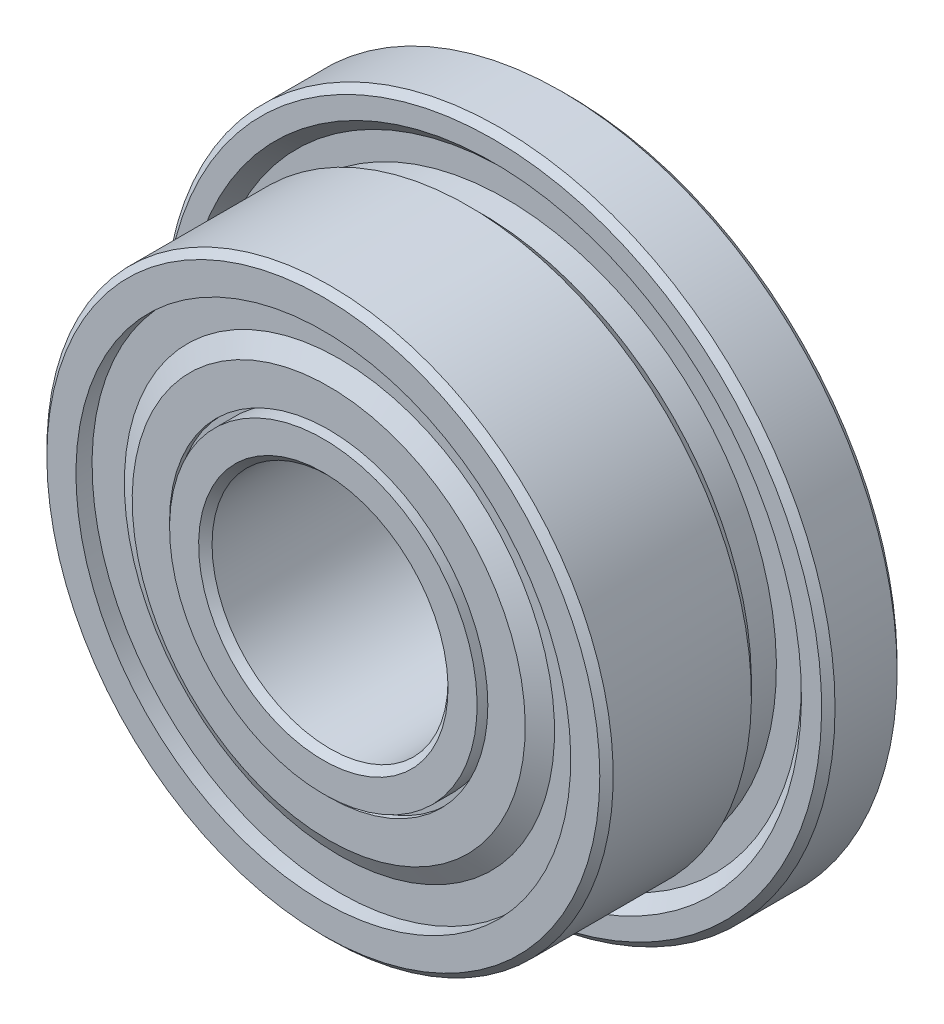
ISO-10303-21;
HEADER;
FILE_DESCRIPTION(('STEP AP214'),'2;1');
FILE_NAME('part.step','',(''),(''),'','','');
FILE_SCHEMA(('AUTOMOTIVE_DESIGN { 1 0 10303 214 1 1 1 1 }'));
ENDSEC;
DATA;
#1=APPLICATION_CONTEXT('core data for automotive mechanical design processes');
#2=APPLICATION_PROTOCOL_DEFINITION('international standard','automotive_design',2000,#1);
#3=PRODUCT_CONTEXT('',#1,'mechanical');
#4=PRODUCT('Part','Part','',(#3));
#5=PRODUCT_RELATED_PRODUCT_CATEGORY('part','',(#4));
#6=PRODUCT_DEFINITION_FORMATION('','',#4);
#7=PRODUCT_DEFINITION_CONTEXT('part definition',#1,'design');
#8=PRODUCT_DEFINITION('design','',#6,#7);
#9=PRODUCT_DEFINITION_SHAPE('','',#8);
#10=(LENGTH_UNIT() NAMED_UNIT(*) SI_UNIT(.MILLI.,.METRE.));
#11=(NAMED_UNIT(*) PLANE_ANGLE_UNIT() SI_UNIT($,.RADIAN.));
#12=(NAMED_UNIT(*) SI_UNIT($,.STERADIAN.) SOLID_ANGLE_UNIT());
#13=UNCERTAINTY_MEASURE_WITH_UNIT(LENGTH_MEASURE(1.E-05),#10,'distance_accuracy_value','');
#14=(GEOMETRIC_REPRESENTATION_CONTEXT(3) GLOBAL_UNCERTAINTY_ASSIGNED_CONTEXT((#13)) GLOBAL_UNIT_ASSIGNED_CONTEXT((#10,
#11,#12)) REPRESENTATION_CONTEXT('',''));
#15=CARTESIAN_POINT('',(0.,0.,0.));
#16=DIRECTION('',(0.,0.,1.));
#17=DIRECTION('',(1.,0.,0.));
#18=AXIS2_PLACEMENT_3D('',#15,#16,#17);
#19=CARTESIAN_POINT('',(0.,0.,0.));
#20=DIRECTION('',(0.,0.,1.));
#21=DIRECTION('',(0.,-1.,0.));
#22=AXIS2_PLACEMENT_3D('',#19,#20,#21);
#23=CYLINDRICAL_SURFACE('',#22,2.62083333333333);
#24=CARTESIAN_POINT('',(0.,0.,-1.0725));
#25=DIRECTION('',(0.,0.,1.));
#26=DIRECTION('',(0.,-1.,0.));
#27=AXIS2_PLACEMENT_3D('',#24,#25,#26);
#28=CIRCLE('',#27,2.62083333333333);
#29=CARTESIAN_POINT('',(0.,-2.62083333333333,-1.0725));
#30=VERTEX_POINT('',#29);
#31=EDGE_CURVE('E85',#30,#30,#28,.T.);
#32=ORIENTED_EDGE('',*,*,#31,.F.);
#33=EDGE_LOOP('',(#32));
#34=FACE_BOUND('',#33,.T.);
#35=CARTESIAN_POINT('',(0.,0.,-1.129375));
#36=DIRECTION('',(0.,0.,1.));
#37=DIRECTION('',(0.,-1.,0.));
#38=AXIS2_PLACEMENT_3D('',#35,#36,#37);
#39=CIRCLE('',#38,2.62083333333333);
#40=CARTESIAN_POINT('',(0.,-2.62083333333333,-1.129375));
#41=VERTEX_POINT('',#40);
#42=EDGE_CURVE('E12',#41,#41,#39,.T.);
#43=ORIENTED_EDGE('',*,*,#42,.T.);
#44=EDGE_LOOP('',(#43));
#45=FACE_BOUND('',#44,.T.);
#46=ADVANCED_FACE('F49',(#34,#45),#23,.T.);
#47=CARTESIAN_POINT('',(0.,2.62083333333333,-1.129375));
#48=DIRECTION('',(0.,0.,1.));
#49=DIRECTION('',(0.,-1.,0.));
#50=AXIS2_PLACEMENT_3D('',#47,#48,#49);
#51=PLANE('',#50);
#52=ORIENTED_EDGE('',*,*,#42,.F.);
#53=EDGE_LOOP('',(#52));
#54=FACE_BOUND('',#53,.T.);
#55=CARTESIAN_POINT('',(0.,0.,-1.129375));
#56=DIRECTION('',(0.,0.,1.));
#57=DIRECTION('',(0.,-1.,0.));
#58=AXIS2_PLACEMENT_3D('',#55,#56,#57);
#59=CIRCLE('',#58,2.27893008651);
#60=CARTESIAN_POINT('',(0.,-2.27893008651,-1.129375));
#61=VERTEX_POINT('',#60);
#62=EDGE_CURVE('E56',#61,#61,#59,.T.);
#63=ORIENTED_EDGE('',*,*,#62,.T.);
#64=EDGE_LOOP('',(#63));
#65=FACE_BOUND('',#64,.T.);
#66=ADVANCED_FACE('F92',(#54,#65),#51,.F.);
#67=CARTESIAN_POINT('',(0.,0.,-1.243125));
#68=DIRECTION('',(0.,0.,1.));
#69=DIRECTION('',(0.,-1.,0.));
#70=AXIS2_PLACEMENT_3D('',#67,#68,#69);
#71=CONICAL_SURFACE('',#70,2.08190930714904,1.0471975511966);
#72=ORIENTED_EDGE('',*,*,#62,.F.);
#73=EDGE_LOOP('',(#72));
#74=FACE_BOUND('',#73,.T.);
#75=CARTESIAN_POINT('',(0.,0.,-1.243125));
#76=DIRECTION('',(0.,0.,1.));
#77=DIRECTION('',(0.,-1.,0.));
#78=AXIS2_PLACEMENT_3D('',#75,#76,#77);
#79=CIRCLE('',#78,2.08190930714904);
#80=CARTESIAN_POINT('',(0.,-2.08190930714904,-1.243125));
#81=VERTEX_POINT('',#80);
#82=EDGE_CURVE('E63',#81,#81,#79,.T.);
#83=ORIENTED_EDGE('',*,*,#82,.T.);
#84=EDGE_LOOP('',(#83));
#85=FACE_BOUND('',#84,.T.);
#86=ADVANCED_FACE('F96',(#74,#85),#71,.T.);
#87=CARTESIAN_POINT('',(0.,2.08190930714904,-1.243125));
#88=DIRECTION('',(0.,0.,1.));
#89=DIRECTION('',(0.,-1.,0.));
#90=AXIS2_PLACEMENT_3D('',#87,#88,#89);
#91=PLANE('',#90);
#92=ORIENTED_EDGE('',*,*,#82,.F.);
#93=EDGE_LOOP('',(#92));
#94=FACE_BOUND('',#93,.T.);
#95=CARTESIAN_POINT('',(0.,0.,-1.243125));
#96=DIRECTION('',(0.,0.,1.));
#97=DIRECTION('',(0.,-1.,0.));
#98=AXIS2_PLACEMENT_3D('',#95,#96,#97);
#99=CIRCLE('',#98,1.68604166666667);
#100=CARTESIAN_POINT('',(0.,-1.68604166666667,-1.243125));
#101=VERTEX_POINT('',#100);
#102=EDGE_CURVE('E69',#101,#101,#99,.T.);
#103=ORIENTED_EDGE('',*,*,#102,.T.);
#104=EDGE_LOOP('',(#103));
#105=FACE_BOUND('',#104,.T.);
#106=ADVANCED_FACE('F101',(#94,#105),#91,.F.);
#107=CARTESIAN_POINT('',(0.,0.,0.));
#108=DIRECTION('',(0.,0.,1.));
#109=DIRECTION('',(0.,-1.,0.));
#110=AXIS2_PLACEMENT_3D('',#107,#108,#109);
#111=CYLINDRICAL_SURFACE('',#110,1.68604166666667);
#112=ORIENTED_EDGE('',*,*,#102,.F.);
#113=EDGE_LOOP('',(#112));
#114=FACE_BOUND('',#113,.T.);
#115=CARTESIAN_POINT('',(0.,0.,-1.18625));
#116=DIRECTION('',(0.,0.,1.));
#117=DIRECTION('',(0.,-1.,0.));
#118=AXIS2_PLACEMENT_3D('',#115,#116,#117);
#119=CIRCLE('',#118,1.68604166666667);
#120=CARTESIAN_POINT('',(0.,-1.68604166666667,-1.18625));
#121=VERTEX_POINT('',#120);
#122=EDGE_CURVE('E75',#121,#121,#119,.T.);
#123=ORIENTED_EDGE('',*,*,#122,.T.);
#124=EDGE_LOOP('',(#123));
#125=FACE_BOUND('',#124,.T.);
#126=ADVANCED_FACE('F107',(#114,#125),#111,.F.);
#127=CARTESIAN_POINT('',(0.,2.06666969682952,-1.18625));
#128=DIRECTION('',(0.,0.,-1.));
#129=DIRECTION('',(0.,1.,0.));
#130=AXIS2_PLACEMENT_3D('',#127,#128,#129);
#131=PLANE('',#130);
#132=ORIENTED_EDGE('',*,*,#122,.F.);
#133=EDGE_LOOP('',(#132));
#134=FACE_BOUND('',#133,.T.);
#135=CARTESIAN_POINT('',(0.,0.,-1.18625));
#136=DIRECTION('',(0.,0.,1.));
#137=DIRECTION('',(0.,-1.,0.));
#138=AXIS2_PLACEMENT_3D('',#135,#136,#137);
#139=CIRCLE('',#138,2.06666969682952);
#140=CARTESIAN_POINT('',(0.,-2.06666969682952,-1.18625));
#141=VERTEX_POINT('',#140);
#142=EDGE_CURVE('E78',#141,#141,#139,.T.);
#143=ORIENTED_EDGE('',*,*,#142,.T.);
#144=EDGE_LOOP('',(#143));
#145=FACE_BOUND('',#144,.T.);
#146=ADVANCED_FACE('F111',(#134,#145),#131,.F.);
#147=CARTESIAN_POINT('',(0.,0.,-1.0725));
#148=DIRECTION('',(0.,0.,1.));
#149=DIRECTION('',(0.,-1.,0.));
#150=AXIS2_PLACEMENT_3D('',#147,#148,#149);
#151=CONICAL_SURFACE('',#150,2.26369047619048,1.0471975511966);
#152=ORIENTED_EDGE('',*,*,#142,.F.);
#153=EDGE_LOOP('',(#152));
#154=FACE_BOUND('',#153,.T.);
#155=CARTESIAN_POINT('',(0.,0.,-1.0725));
#156=DIRECTION('',(0.,0.,1.));
#157=DIRECTION('',(0.,-1.,0.));
#158=AXIS2_PLACEMENT_3D('',#155,#156,#157);
#159=CIRCLE('',#158,2.26369047619048);
#160=CARTESIAN_POINT('',(0.,-2.26369047619048,-1.0725));
#161=VERTEX_POINT('',#160);
#162=EDGE_CURVE('E82',#161,#161,#159,.T.);
#163=ORIENTED_EDGE('',*,*,#162,.T.);
#164=EDGE_LOOP('',(#163));
#165=FACE_BOUND('',#164,.T.);
#166=ADVANCED_FACE('F115',(#154,#165),#151,.F.);
#167=CARTESIAN_POINT('',(0.,2.62083333333333,-1.0725));
#168=DIRECTION('',(0.,0.,-1.));
#169=DIRECTION('',(0.,1.,0.));
#170=AXIS2_PLACEMENT_3D('',#167,#168,#169);
#171=PLANE('',#170);
#172=ORIENTED_EDGE('',*,*,#162,.F.);
#173=EDGE_LOOP('',(#172));
#174=FACE_BOUND('',#173,.T.);
#175=ORIENTED_EDGE('',*,*,#31,.T.);
#176=EDGE_LOOP('',(#175));
#177=FACE_BOUND('',#176,.T.);
#178=ADVANCED_FACE('F89',(#174,#177),#171,.F.);
#179=CLOSED_SHELL('',(#46,#66,#86,#106,#126,#146,#166,#178));
#180=MANIFOLD_SOLID_BREP('B2',#179);
#181=CARTESIAN_POINT('',(0.,0.,0.));
#182=DIRECTION('',(0.,0.,1.));
#183=DIRECTION('',(0.,-1.,0.));
#184=AXIS2_PLACEMENT_3D('',#181,#182,#183);
#185=CYLINDRICAL_SURFACE('',#184,2.62083333333333);
#186=CARTESIAN_POINT('',(0.,0.,1.129375));
#187=DIRECTION('',(0.,0.,1.));
#188=DIRECTION('',(0.,-1.,0.));
#189=AXIS2_PLACEMENT_3D('',#186,#187,#188);
#190=CIRCLE('',#189,2.62083333333333);
#191=CARTESIAN_POINT('',(0.,-2.62083333333333,1.129375));
#192=VERTEX_POINT('',#191);
#193=EDGE_CURVE('E48',#192,#192,#190,.T.);
#194=ORIENTED_EDGE('',*,*,#193,.F.);
#195=EDGE_LOOP('',(#194));
#196=FACE_BOUND('',#195,.T.);
#197=CARTESIAN_POINT('',(0.,0.,1.0725));
#198=DIRECTION('',(0.,0.,1.));
#199=DIRECTION('',(0.,-1.,0.));
#200=AXIS2_PLACEMENT_3D('',#197,#198,#199);
#201=CIRCLE('',#200,2.62083333333333);
#202=CARTESIAN_POINT('',(0.,-2.62083333333333,1.0725));
#203=VERTEX_POINT('',#202);
#204=EDGE_CURVE('E226',#203,#203,#201,.T.);
#205=ORIENTED_EDGE('',*,*,#204,.T.);
#206=EDGE_LOOP('',(#205));
#207=FACE_BOUND('',#206,.T.);
#208=ADVANCED_FACE('F190',(#196,#207),#185,.T.);
#209=CARTESIAN_POINT('',(0.,2.62083333333333,1.129375));
#210=DIRECTION('',(0.,0.,-1.));
#211=DIRECTION('',(0.,1.,0.));
#212=AXIS2_PLACEMENT_3D('',#209,#210,#211);
#213=PLANE('',#212);
#214=CARTESIAN_POINT('',(0.,0.,1.129375));
#215=DIRECTION('',(0.,0.,1.));
#216=DIRECTION('',(0.,-1.,0.));
#217=AXIS2_PLACEMENT_3D('',#214,#215,#216);
#218=CIRCLE('',#217,2.27893008651);
#219=CARTESIAN_POINT('',(0.,-2.27893008651,1.129375));
#220=VERTEX_POINT('',#219);
#221=EDGE_CURVE('E197',#220,#220,#218,.T.);
#222=ORIENTED_EDGE('',*,*,#221,.F.);
#223=EDGE_LOOP('',(#222));
#224=FACE_BOUND('',#223,.T.);
#225=ORIENTED_EDGE('',*,*,#193,.T.);
#226=EDGE_LOOP('',(#225));
#227=FACE_BOUND('',#226,.T.);
#228=ADVANCED_FACE('F263',(#224,#227),#213,.F.);
#229=CARTESIAN_POINT('',(0.,0.,1.129375));
#230=DIRECTION('',(0.,0.,-1.));
#231=DIRECTION('',(0.,1.,0.));
#232=AXIS2_PLACEMENT_3D('',#229,#230,#231);
#233=CONICAL_SURFACE('',#232,2.27893008651,1.0471975511966);
#234=CARTESIAN_POINT('',(0.,0.,1.243125));
#235=DIRECTION('',(0.,0.,1.));
#236=DIRECTION('',(0.,-1.,0.));
#237=AXIS2_PLACEMENT_3D('',#234,#235,#236);
#238=CIRCLE('',#237,2.08190930714904);
#239=CARTESIAN_POINT('',(0.,-2.08190930714904,1.243125));
#240=VERTEX_POINT('',#239);
#241=EDGE_CURVE('E204',#240,#240,#238,.T.);
#242=ORIENTED_EDGE('',*,*,#241,.F.);
#243=EDGE_LOOP('',(#242));
#244=FACE_BOUND('',#243,.T.);
#245=ORIENTED_EDGE('',*,*,#221,.T.);
#246=EDGE_LOOP('',(#245));
#247=FACE_BOUND('',#246,.T.);
#248=ADVANCED_FACE('F258',(#244,#247),#233,.T.);
#249=CARTESIAN_POINT('',(0.,2.08190930714904,1.243125));
#250=DIRECTION('',(0.,0.,-1.));
#251=DIRECTION('',(0.,1.,0.));
#252=AXIS2_PLACEMENT_3D('',#249,#250,#251);
#253=PLANE('',#252);
#254=CARTESIAN_POINT('',(0.,0.,1.243125));
#255=DIRECTION('',(0.,0.,1.));
#256=DIRECTION('',(0.,-1.,0.));
#257=AXIS2_PLACEMENT_3D('',#254,#255,#256);
#258=CIRCLE('',#257,1.68604166666667);
#259=CARTESIAN_POINT('',(0.,-1.68604166666667,1.243125));
#260=VERTEX_POINT('',#259);
#261=EDGE_CURVE('E210',#260,#260,#258,.T.);
#262=ORIENTED_EDGE('',*,*,#261,.F.);
#263=EDGE_LOOP('',(#262));
#264=FACE_BOUND('',#263,.T.);
#265=ORIENTED_EDGE('',*,*,#241,.T.);
#266=EDGE_LOOP('',(#265));
#267=FACE_BOUND('',#266,.T.);
#268=ADVANCED_FACE('F252',(#264,#267),#253,.F.);
#269=CARTESIAN_POINT('',(0.,0.,0.));
#270=DIRECTION('',(0.,0.,1.));
#271=DIRECTION('',(0.,-1.,0.));
#272=AXIS2_PLACEMENT_3D('',#269,#270,#271);
#273=CYLINDRICAL_SURFACE('',#272,1.68604166666667);
#274=CARTESIAN_POINT('',(0.,0.,1.18625));
#275=DIRECTION('',(0.,0.,1.));
#276=DIRECTION('',(0.,-1.,0.));
#277=AXIS2_PLACEMENT_3D('',#274,#275,#276);
#278=CIRCLE('',#277,1.68604166666667);
#279=CARTESIAN_POINT('',(0.,-1.68604166666667,1.18625));
#280=VERTEX_POINT('',#279);
#281=EDGE_CURVE('E216',#280,#280,#278,.T.);
#282=ORIENTED_EDGE('',*,*,#281,.F.);
#283=EDGE_LOOP('',(#282));
#284=FACE_BOUND('',#283,.T.);
#285=ORIENTED_EDGE('',*,*,#261,.T.);
#286=EDGE_LOOP('',(#285));
#287=FACE_BOUND('',#286,.T.);
#288=ADVANCED_FACE('F246',(#284,#287),#273,.F.);
#289=CARTESIAN_POINT('',(0.,2.06666969682952,1.18625));
#290=DIRECTION('',(0.,0.,1.));
#291=DIRECTION('',(0.,-1.,0.));
#292=AXIS2_PLACEMENT_3D('',#289,#290,#291);
#293=PLANE('',#292);
#294=CARTESIAN_POINT('',(0.,0.,1.18625));
#295=DIRECTION('',(0.,0.,1.));
#296=DIRECTION('',(0.,-1.,0.));
#297=AXIS2_PLACEMENT_3D('',#294,#295,#296);
#298=CIRCLE('',#297,2.06666969682952);
#299=CARTESIAN_POINT('',(0.,-2.06666969682952,1.18625));
#300=VERTEX_POINT('',#299);
#301=EDGE_CURVE('E220',#300,#300,#298,.T.);
#302=ORIENTED_EDGE('',*,*,#301,.F.);
#303=EDGE_LOOP('',(#302));
#304=FACE_BOUND('',#303,.T.);
#305=ORIENTED_EDGE('',*,*,#281,.T.);
#306=EDGE_LOOP('',(#305));
#307=FACE_BOUND('',#306,.T.);
#308=ADVANCED_FACE('F240',(#304,#307),#293,.F.);
#309=CARTESIAN_POINT('',(0.,0.,1.18625));
#310=DIRECTION('',(0.,0.,-1.));
#311=DIRECTION('',(0.,1.,0.));
#312=AXIS2_PLACEMENT_3D('',#309,#310,#311);
#313=CONICAL_SURFACE('',#312,2.06666969682952,1.0471975511966);
#314=CARTESIAN_POINT('',(0.,0.,1.0725));
#315=DIRECTION('',(0.,0.,1.));
#316=DIRECTION('',(0.,-1.,0.));
#317=AXIS2_PLACEMENT_3D('',#314,#315,#316);
#318=CIRCLE('',#317,2.26369047619048);
#319=CARTESIAN_POINT('',(0.,-2.26369047619048,1.0725));
#320=VERTEX_POINT('',#319);
#321=EDGE_CURVE('E223',#320,#320,#318,.T.);
#322=ORIENTED_EDGE('',*,*,#321,.F.);
#323=EDGE_LOOP('',(#322));
#324=FACE_BOUND('',#323,.T.);
#325=ORIENTED_EDGE('',*,*,#301,.T.);
#326=EDGE_LOOP('',(#325));
#327=FACE_BOUND('',#326,.T.);
#328=ADVANCED_FACE('F234',(#324,#327),#313,.F.);
#329=CARTESIAN_POINT('',(0.,2.62083333333333,1.0725));
#330=DIRECTION('',(0.,0.,1.));
#331=DIRECTION('',(0.,-1.,0.));
#332=AXIS2_PLACEMENT_3D('',#329,#330,#331);
#333=PLANE('',#332);
#334=ORIENTED_EDGE('',*,*,#204,.F.);
#335=EDGE_LOOP('',(#334));
#336=FACE_BOUND('',#335,.T.);
#337=ORIENTED_EDGE('',*,*,#321,.T.);
#338=EDGE_LOOP('',(#337));
#339=FACE_BOUND('',#338,.T.);
#340=ADVANCED_FACE('F231',(#336,#339),#333,.F.);
#341=CLOSED_SHELL('',(#208,#228,#248,#268,#288,#308,#328,#340));
#342=MANIFOLD_SOLID_BREP('B7',#341);
#343=CARTESIAN_POINT('',(-0.987536740592985,1.88159405451308,0.));
#344=DIRECTION('',(-0.464723172043757,0.885456025653216,0.));
#345=DIRECTION('',(0.885456025653216,0.464723172043757,0.));
#346=AXIS2_PLACEMENT_3D('',#343,#344,#345);
#347=SPHERICAL_SURFACE('',#346,0.4);
#348=CARTESIAN_POINT('',(-1.17342600941049,2.23577646477437,0.));
#349=VERTEX_POINT('',#348);
#350=VERTEX_LOOP('',#349);
#351=FACE_BOUND('',#350,.T.);
#352=ADVANCED_FACE('F333',(#351),#347,.T.);
#353=CLOSED_SHELL('',(#352));
#354=MANIFOLD_SOLID_BREP('B43',#353);
#355=CARTESIAN_POINT('',(-1.74884071502401,1.20713758680373,0.));
#356=DIRECTION('',(-0.822983865893649,0.568064746731166,0.));
#357=DIRECTION('',(0.568064746731166,0.822983865893649,0.));
#358=AXIS2_PLACEMENT_3D('',#355,#356,#357);
#359=SPHERICAL_SURFACE('',#358,0.4);
#360=CARTESIAN_POINT('',(-2.07803426138147,1.43436348549619,0.));
#361=VERTEX_POINT('',#360);
#362=VERTEX_LOOP('',#361);
#363=FACE_BOUND('',#362,.T.);
#364=ADVANCED_FACE('F352',(#363),#359,.T.);
#365=CLOSED_SHELL('',(#364));
#366=MANIFOLD_SOLID_BREP('B186',#365);
#367=CARTESIAN_POINT('',(-2.10950635745836,0.256140445542584,0.));
#368=DIRECTION('',(-0.992708874098053,0.120536680255334,0.));
#369=DIRECTION('',(0.120536680255334,0.992708874098053,0.));
#370=AXIS2_PLACEMENT_3D('',#367,#368,#369);
#371=SPHERICAL_SURFACE('',#370,0.4);
#372=CARTESIAN_POINT('',(-2.50658990709758,0.304355117644718,0.));
#373=VERTEX_POINT('',#372);
#374=VERTEX_LOOP('',#373);
#375=FACE_BOUND('',#374,.T.);
#376=ADVANCED_FACE('F371',(#375),#371,.T.);
#377=CLOSED_SHELL('',(#376));
#378=MANIFOLD_SOLID_BREP('B329',#377);
#379=CARTESIAN_POINT('',(-1.98690951570651,-0.75353538496537,0.));
#380=DIRECTION('',(-0.935016242685418,-0.354604887042527,0.));
#381=DIRECTION('',(-0.354604887042527,0.935016242685418,0.));
#382=AXIS2_PLACEMENT_3D('',#379,#380,#381);
#383=SPHERICAL_SURFACE('',#382,0.4);
#384=CARTESIAN_POINT('',(-2.36091601278068,-0.89537733978238,0.));
#385=VERTEX_POINT('',#384);
#386=VERTEX_LOOP('',#385);
#387=FACE_BOUND('',#386,.T.);
#388=ADVANCED_FACE('F389',(#387),#383,.T.);
#389=CLOSED_SHELL('',(#388));
#390=MANIFOLD_SOLID_BREP('B348',#389);
#391=CARTESIAN_POINT('',(-1.4091356487617,-1.59058533986358,0.));
#392=DIRECTION('',(-0.663122658240802,-0.748510748171095,0.));
#393=DIRECTION('',(-0.748510748171095,0.663122658240802,0.));
#394=AXIS2_PLACEMENT_3D('',#391,#392,#393);
#395=SPHERICAL_SURFACE('',#394,0.4);
#396=CARTESIAN_POINT('',(-1.67438471205802,-1.88998963913202,0.));
#397=VERTEX_POINT('',#396);
#398=VERTEX_LOOP('',#397);
#399=FACE_BOUND('',#398,.T.);
#400=ADVANCED_FACE('F408',(#399),#395,.T.);
#401=CLOSED_SHELL('',(#400));
#402=MANIFOLD_SOLID_BREP('B367',#401);
#403=CARTESIAN_POINT('',(-0.508545786611076,-2.06325136203036,0.));
#404=DIRECTION('',(-0.239315664287565,-0.97094181742605,0.));
#405=DIRECTION('',(-0.97094181742605,0.239315664287565,0.));
#406=AXIS2_PLACEMENT_3D('',#403,#404,#405);
#407=SPHERICAL_SURFACE('',#406,0.4);
#408=CARTESIAN_POINT('',(-0.604272052326102,-2.45162808900078,0.));
#409=VERTEX_POINT('',#408);
#410=VERTEX_LOOP('',#409);
#411=FACE_BOUND('',#410,.T.);
#412=ADVANCED_FACE('F427',(#411),#407,.T.);
#413=CLOSED_SHELL('',(#412));
#414=MANIFOLD_SOLID_BREP('B385',#413);
#415=CARTESIAN_POINT('',(0.508545786611047,-2.06325136203036,0.));
#416=DIRECTION('',(0.239315664287552,-0.970941817426054,0.));
#417=DIRECTION('',(-0.970941817426054,-0.239315664287552,0.));
#418=AXIS2_PLACEMENT_3D('',#415,#416,#417);
#419=SPHERICAL_SURFACE('',#418,0.4);
#420=CARTESIAN_POINT('',(0.604272052326068,-2.45162808900079,0.));
#421=VERTEX_POINT('',#420);
#422=VERTEX_LOOP('',#421);
#423=FACE_BOUND('',#422,.T.);
#424=ADVANCED_FACE('F446',(#423),#419,.T.);
#425=CLOSED_SHELL('',(#424));
#426=MANIFOLD_SOLID_BREP('B404',#425);
#427=CARTESIAN_POINT('',(1.40913564876168,-1.5905853398636,0.));
#428=DIRECTION('',(0.663122658240791,-0.748510748171105,0.));
#429=DIRECTION('',(-0.748510748171105,-0.663122658240791,0.));
#430=AXIS2_PLACEMENT_3D('',#427,#428,#429);
#431=SPHERICAL_SURFACE('',#430,0.4);
#432=CARTESIAN_POINT('',(1.674384712058,-1.88998963913204,0.));
#433=VERTEX_POINT('',#432);
#434=VERTEX_LOOP('',#433);
#435=FACE_BOUND('',#434,.T.);
#436=ADVANCED_FACE('F465',(#435),#431,.T.);
#437=CLOSED_SHELL('',(#436));
#438=MANIFOLD_SOLID_BREP('B423',#437);
#439=CARTESIAN_POINT('',(1.9869095157065,-0.753535384965397,0.));
#440=DIRECTION('',(0.935016242685413,-0.35460488704254,0.));
#441=DIRECTION('',(-0.35460488704254,-0.935016242685413,0.));
#442=AXIS2_PLACEMENT_3D('',#439,#440,#441);
#443=SPHERICAL_SURFACE('',#442,0.4);
#444=CARTESIAN_POINT('',(2.36091601278067,-0.895377339782413,0.));
#445=VERTEX_POINT('',#444);
#446=VERTEX_LOOP('',#445);
#447=FACE_BOUND('',#446,.T.);
#448=ADVANCED_FACE('F483',(#447),#443,.T.);
#449=CLOSED_SHELL('',(#448));
#450=MANIFOLD_SOLID_BREP('B442',#449);
#451=CARTESIAN_POINT('',(2.10950635745837,0.256140445542555,0.));
#452=DIRECTION('',(0.992708874098054,0.12053668025532,0.));
#453=DIRECTION('',(0.12053668025532,-0.992708874098054,0.));
#454=AXIS2_PLACEMENT_3D('',#451,#452,#453);
#455=SPHERICAL_SURFACE('',#454,0.4);
#456=CARTESIAN_POINT('',(2.50658990709759,0.304355117644683,0.));
#457=VERTEX_POINT('',#456);
#458=VERTEX_LOOP('',#457);
#459=FACE_BOUND('',#458,.T.);
#460=ADVANCED_FACE('F501',(#459),#455,.T.);
#461=CLOSED_SHELL('',(#460));
#462=MANIFOLD_SOLID_BREP('B461',#461);
#463=CARTESIAN_POINT('',(1.74884071502402,1.2071375868037,0.));
#464=DIRECTION('',(0.822983865893658,0.568064746731154,0.));
#465=DIRECTION('',(0.568064746731154,-0.822983865893658,0.));
#466=AXIS2_PLACEMENT_3D('',#463,#464,#465);
#467=SPHERICAL_SURFACE('',#466,0.4);
#468=CARTESIAN_POINT('',(2.07803426138149,1.43436348549616,0.));
#469=VERTEX_POINT('',#468);
#470=VERTEX_LOOP('',#469);
#471=FACE_BOUND('',#470,.T.);
#472=ADVANCED_FACE('F520',(#471),#467,.T.);
#473=CLOSED_SHELL('',(#472));
#474=MANIFOLD_SOLID_BREP('B479',#473);
#475=CARTESIAN_POINT('',(0.98753674059301,1.88159405451307,0.));
#476=DIRECTION('',(0.464723172043769,0.885456025653209,0.));
#477=DIRECTION('',(0.885456025653209,-0.464723172043769,0.));
#478=AXIS2_PLACEMENT_3D('',#475,#476,#477);
#479=SPHERICAL_SURFACE('',#478,0.4);
#480=CARTESIAN_POINT('',(1.17342600941052,2.23577646477435,0.));
#481=VERTEX_POINT('',#480);
#482=VERTEX_LOOP('',#481);
#483=FACE_BOUND('',#482,.T.);
#484=ADVANCED_FACE('F538',(#483),#479,.T.);
#485=CLOSED_SHELL('',(#484));
#486=MANIFOLD_SOLID_BREP('B497',#485);
#487=CARTESIAN_POINT('',(0.,2.125,0.));
#488=DIRECTION('',(0.,1.,0.));
#489=DIRECTION('',(1.,0.,0.));
#490=AXIS2_PLACEMENT_3D('',#487,#488,#489);
#491=SPHERICAL_SURFACE('',#490,0.4);
#492=CARTESIAN_POINT('',(0.,2.525,0.));
#493=VERTEX_POINT('',#492);
#494=VERTEX_LOOP('',#493);
#495=FACE_BOUND('',#494,.T.);
#496=ADVANCED_FACE('F560',(#495),#491,.T.);
#497=CLOSED_SHELL('',(#496));
#498=MANIFOLD_SOLID_BREP('B516',#497);
#499=CARTESIAN_POINT('',(0.,0.,0.));
#500=DIRECTION('',(0.,0.,1.));
#501=DIRECTION('',(0.,-1.,0.));
#502=AXIS2_PLACEMENT_3D('',#499,#500,#501);
#503=CYLINDRICAL_SURFACE('',#502,1.81875);
#504=CARTESIAN_POINT('',(0.,0.,0.257314860627986));
#505=DIRECTION('',(0.,0.,1.));
#506=DIRECTION('',(0.,-1.,0.));
#507=AXIS2_PLACEMENT_3D('',#504,#505,#506);
#508=CIRCLE('',#507,1.81875);
#509=CARTESIAN_POINT('',(0.,-1.81875,0.257314860627986));
#510=VERTEX_POINT('',#509);
#511=EDGE_CURVE('E610',#510,#510,#508,.T.);
#512=ORIENTED_EDGE('',*,*,#511,.T.);
#513=EDGE_LOOP('',(#512));
#514=FACE_BOUND('',#513,.T.);
#515=CARTESIAN_POINT('',(0.,0.,1.0725));
#516=DIRECTION('',(0.,0.,1.));
#517=DIRECTION('',(0.,-1.,0.));
#518=AXIS2_PLACEMENT_3D('',#515,#516,#517);
#519=CIRCLE('',#518,1.81875);
#520=CARTESIAN_POINT('',(0.,-1.81875,1.0725));
#521=VERTEX_POINT('',#520);
#522=EDGE_CURVE('E633',#521,#521,#519,.T.);
#523=ORIENTED_EDGE('',*,*,#522,.F.);
#524=EDGE_LOOP('',(#523));
#525=FACE_BOUND('',#524,.T.);
#526=ADVANCED_FACE('F581',(#514,#525),#503,.T.);
#527=CARTESIAN_POINT('',(0.,1.25,1.3));
#528=DIRECTION('',(0.,0.,-1.));
#529=DIRECTION('',(0.,1.,0.));
#530=AXIS2_PLACEMENT_3D('',#527,#528,#529);
#531=PLANE('',#530);
#532=CARTESIAN_POINT('',(0.,0.,1.3));
#533=DIRECTION('',(0.,0.,-1.));
#534=DIRECTION('',(0.,1.,0.));
#535=AXIS2_PLACEMENT_3D('',#532,#533,#534);
#536=CIRCLE('',#535,1.32109375);
#537=CARTESIAN_POINT('',(0.,1.32109375,1.3));
#538=VERTEX_POINT('',#537);
#539=EDGE_CURVE('E559',#538,#538,#536,.T.);
#540=ORIENTED_EDGE('',*,*,#539,.T.);
#541=EDGE_LOOP('',(#540));
#542=FACE_BOUND('',#541,.T.);
#543=CARTESIAN_POINT('',(0.,0.,1.3));
#544=DIRECTION('',(0.,0.,1.));
#545=DIRECTION('',(0.,-1.,0.));
#546=AXIS2_PLACEMENT_3D('',#543,#544,#545);
#547=CIRCLE('',#546,1.62916666666667);
#548=CARTESIAN_POINT('',(0.,-1.62916666666667,1.3));
#549=VERTEX_POINT('',#548);
#550=EDGE_CURVE('E625',#549,#549,#547,.T.);
#551=ORIENTED_EDGE('',*,*,#550,.T.);
#552=EDGE_LOOP('',(#551));
#553=FACE_BOUND('',#552,.T.);
#554=ADVANCED_FACE('F642',(#542,#553),#531,.F.);
#555=CARTESIAN_POINT('',(0.,0.,0.));
#556=DIRECTION('',(0.,0.,1.));
#557=DIRECTION('',(0.,-1.,0.));
#558=AXIS2_PLACEMENT_3D('',#555,#556,#557);
#559=CYLINDRICAL_SURFACE('',#558,1.81875);
#560=CARTESIAN_POINT('',(0.,0.,-0.257314860627987));
#561=DIRECTION('',(0.,0.,1.));
#562=DIRECTION('',(0.,-1.,0.));
#563=AXIS2_PLACEMENT_3D('',#560,#561,#562);
#564=CIRCLE('',#563,1.81875);
#565=CARTESIAN_POINT('',(0.,-1.81875,-0.257314860627987));
#566=VERTEX_POINT('',#565);
#567=EDGE_CURVE('E606',#566,#566,#564,.T.);
#568=ORIENTED_EDGE('',*,*,#567,.F.);
#569=EDGE_LOOP('',(#568));
#570=FACE_BOUND('',#569,.T.);
#571=CARTESIAN_POINT('',(0.,0.,-1.0725));
#572=DIRECTION('',(0.,0.,1.));
#573=DIRECTION('',(0.,-1.,0.));
#574=AXIS2_PLACEMENT_3D('',#571,#572,#573);
#575=CIRCLE('',#574,1.81875);
#576=CARTESIAN_POINT('',(0.,-1.81875,-1.0725));
#577=VERTEX_POINT('',#576);
#578=EDGE_CURVE('E622',#577,#577,#575,.T.);
#579=ORIENTED_EDGE('',*,*,#578,.T.);
#580=EDGE_LOOP('',(#579));
#581=FACE_BOUND('',#580,.T.);
#582=ADVANCED_FACE('F648',(#570,#581),#559,.T.);
#583=CARTESIAN_POINT('',(0.,1.81875,-1.3));
#584=DIRECTION('',(0.,0.,1.));
#585=DIRECTION('',(0.,-1.,0.));
#586=AXIS2_PLACEMENT_3D('',#583,#584,#585);
#587=PLANE('',#586);
#588=CARTESIAN_POINT('',(0.,0.,-1.3));
#589=DIRECTION('',(0.,0.,1.));
#590=DIRECTION('',(0.,-1.,0.));
#591=AXIS2_PLACEMENT_3D('',#588,#589,#590);
#592=CIRCLE('',#591,1.32109375);
#593=CARTESIAN_POINT('',(0.,-1.32109375,-1.3));
#594=VERTEX_POINT('',#593);
#595=EDGE_CURVE('E601',#594,#594,#592,.T.);
#596=ORIENTED_EDGE('',*,*,#595,.T.);
#597=EDGE_LOOP('',(#596));
#598=FACE_BOUND('',#597,.T.);
#599=CARTESIAN_POINT('',(0.,0.,-1.3));
#600=DIRECTION('',(0.,0.,1.));
#601=DIRECTION('',(0.,-1.,0.));
#602=AXIS2_PLACEMENT_3D('',#599,#600,#601);
#603=CIRCLE('',#602,1.62916666666667);
#604=CARTESIAN_POINT('',(0.,-1.62916666666667,-1.3));
#605=VERTEX_POINT('',#604);
#606=EDGE_CURVE('E614',#605,#605,#603,.T.);
#607=ORIENTED_EDGE('',*,*,#606,.F.);
#608=EDGE_LOOP('',(#607));
#609=FACE_BOUND('',#608,.T.);
#610=ADVANCED_FACE('F656',(#598,#609),#587,.F.);
#611=CARTESIAN_POINT('',(0.,0.,0.));
#612=DIRECTION('',(0.,0.,1.));
#613=DIRECTION('',(0.,-1.,0.));
#614=AXIS2_PLACEMENT_3D('',#611,#612,#613);
#615=TOROIDAL_SURFACE('',#614,2.125,0.4);
#616=ORIENTED_EDGE('',*,*,#511,.F.);
#617=EDGE_LOOP('',(#616));
#618=FACE_BOUND('',#617,.T.);
#619=ORIENTED_EDGE('',*,*,#567,.T.);
#620=EDGE_LOOP('',(#619));
#621=FACE_BOUND('',#620,.T.);
#622=ADVANCED_FACE('F652',(#618,#621),#615,.F.);
#623=CARTESIAN_POINT('',(0.,0.,0.));
#624=DIRECTION('',(0.,0.,1.));
#625=DIRECTION('',(0.,-1.,0.));
#626=AXIS2_PLACEMENT_3D('',#623,#624,#625);
#627=CYLINDRICAL_SURFACE('',#626,1.25);
#628=CARTESIAN_POINT('',(0.,0.,-1.22890625));
#629=DIRECTION('',(0.,0.,1.));
#630=DIRECTION('',(0.,-1.,0.));
#631=AXIS2_PLACEMENT_3D('',#628,#629,#630);
#632=CIRCLE('',#631,1.25);
#633=CARTESIAN_POINT('',(0.,-1.25,-1.22890625));
#634=VERTEX_POINT('',#633);
#635=EDGE_CURVE('E589',#634,#634,#632,.F.);
#636=ORIENTED_EDGE('',*,*,#635,.T.);
#637=EDGE_LOOP('',(#636));
#638=FACE_BOUND('',#637,.T.);
#639=CARTESIAN_POINT('',(0.,0.,1.22890625));
#640=DIRECTION('',(0.,0.,-1.));
#641=DIRECTION('',(0.,1.,0.));
#642=AXIS2_PLACEMENT_3D('',#639,#640,#641);
#643=CIRCLE('',#642,1.25);
#644=CARTESIAN_POINT('',(0.,1.25,1.22890625));
#645=VERTEX_POINT('',#644);
#646=EDGE_CURVE('E595',#645,#645,#643,.F.);
#647=ORIENTED_EDGE('',*,*,#646,.T.);
#648=EDGE_LOOP('',(#647));
#649=FACE_BOUND('',#648,.T.);
#650=ADVANCED_FACE('F655',(#638,#649),#627,.F.);
#651=CARTESIAN_POINT('',(0.,0.,-1.3));
#652=DIRECTION('',(0.,0.,-1.));
#653=DIRECTION('',(0.,1.,0.));
#654=AXIS2_PLACEMENT_3D('',#651,#652,#653);
#655=CONICAL_SURFACE('',#654,1.32109375,0.785398163397448);
#656=ORIENTED_EDGE('',*,*,#635,.F.);
#657=EDGE_LOOP('',(#656));
#658=FACE_BOUND('',#657,.T.);
#659=ORIENTED_EDGE('',*,*,#595,.F.);
#660=EDGE_LOOP('',(#659));
#661=FACE_BOUND('',#660,.T.);
#662=ADVANCED_FACE('F660',(#658,#661),#655,.F.);
#663=CARTESIAN_POINT('',(0.,0.,1.22890625));
#664=DIRECTION('',(0.,0.,1.));
#665=DIRECTION('',(0.,-1.,0.));
#666=AXIS2_PLACEMENT_3D('',#663,#664,#665);
#667=CONICAL_SURFACE('',#666,1.25,0.785398163397448);
#668=ORIENTED_EDGE('',*,*,#539,.F.);
#669=EDGE_LOOP('',(#668));
#670=FACE_BOUND('',#669,.T.);
#671=ORIENTED_EDGE('',*,*,#646,.F.);
#672=EDGE_LOOP('',(#671));
#673=FACE_BOUND('',#672,.T.);
#674=ADVANCED_FACE('F583',(#670,#673),#667,.F.);
#675=CARTESIAN_POINT('',(0.,0.,0.));
#676=DIRECTION('',(0.,0.,1.));
#677=DIRECTION('',(0.,-1.,0.));
#678=AXIS2_PLACEMENT_3D('',#675,#676,#677);
#679=CYLINDRICAL_SURFACE('',#678,1.62916666666667);
#680=ORIENTED_EDGE('',*,*,#606,.T.);
#681=EDGE_LOOP('',(#680));
#682=FACE_BOUND('',#681,.T.);
#683=CARTESIAN_POINT('',(0.,0.,-1.0725));
#684=DIRECTION('',(0.,0.,1.));
#685=DIRECTION('',(0.,-1.,0.));
#686=AXIS2_PLACEMENT_3D('',#683,#684,#685);
#687=CIRCLE('',#686,1.62916666666667);
#688=CARTESIAN_POINT('',(0.,-1.62916666666667,-1.0725));
#689=VERTEX_POINT('',#688);
#690=EDGE_CURVE('E618',#689,#689,#687,.T.);
#691=ORIENTED_EDGE('',*,*,#690,.F.);
#692=EDGE_LOOP('',(#691));
#693=FACE_BOUND('',#692,.T.);
#694=ADVANCED_FACE('F667',(#682,#693),#679,.T.);
#695=CARTESIAN_POINT('',(0.,1.81875,-1.0725));
#696=DIRECTION('',(0.,0.,-1.));
#697=DIRECTION('',(0.,1.,0.));
#698=AXIS2_PLACEMENT_3D('',#695,#696,#697);
#699=PLANE('',#698);
#700=ORIENTED_EDGE('',*,*,#690,.T.);
#701=EDGE_LOOP('',(#700));
#702=FACE_BOUND('',#701,.T.);
#703=ORIENTED_EDGE('',*,*,#578,.F.);
#704=EDGE_LOOP('',(#703));
#705=FACE_BOUND('',#704,.T.);
#706=ADVANCED_FACE('F679',(#702,#705),#699,.T.);
#707=CARTESIAN_POINT('',(0.,0.,0.));
#708=DIRECTION('',(0.,0.,1.));
#709=DIRECTION('',(0.,-1.,0.));
#710=AXIS2_PLACEMENT_3D('',#707,#708,#709);
#711=CYLINDRICAL_SURFACE('',#710,1.62916666666667);
#712=CARTESIAN_POINT('',(0.,0.,1.0725));
#713=DIRECTION('',(0.,0.,1.));
#714=DIRECTION('',(0.,-1.,0.));
#715=AXIS2_PLACEMENT_3D('',#712,#713,#714);
#716=CIRCLE('',#715,1.62916666666667);
#717=CARTESIAN_POINT('',(0.,-1.62916666666667,1.0725));
#718=VERTEX_POINT('',#717);
#719=EDGE_CURVE('E629',#718,#718,#716,.T.);
#720=ORIENTED_EDGE('',*,*,#719,.T.);
#721=EDGE_LOOP('',(#720));
#722=FACE_BOUND('',#721,.T.);
#723=ORIENTED_EDGE('',*,*,#550,.F.);
#724=EDGE_LOOP('',(#723));
#725=FACE_BOUND('',#724,.T.);
#726=ADVANCED_FACE('F685',(#722,#725),#711,.T.);
#727=CARTESIAN_POINT('',(0.,1.81875,1.0725));
#728=DIRECTION('',(0.,0.,1.));
#729=DIRECTION('',(0.,-1.,0.));
#730=AXIS2_PLACEMENT_3D('',#727,#728,#729);
#731=PLANE('',#730);
#732=ORIENTED_EDGE('',*,*,#522,.T.);
#733=EDGE_LOOP('',(#732));
#734=FACE_BOUND('',#733,.T.);
#735=ORIENTED_EDGE('',*,*,#719,.F.);
#736=EDGE_LOOP('',(#735));
#737=FACE_BOUND('',#736,.T.);
#738=ADVANCED_FACE('F638',(#734,#737),#731,.T.);
#739=CLOSED_SHELL('',(#526,#554,#582,#610,#622,#650,#662,#674,#694,#706,#726,#738));
#740=MANIFOLD_SOLID_BREP('B534',#739);
#741=CARTESIAN_POINT('',(0.,2.43125,-1.3));
#742=DIRECTION('',(0.,0.,1.));
#743=DIRECTION('',(0.,-1.,0.));
#744=AXIS2_PLACEMENT_3D('',#741,#742,#743);
#745=PLANE('',#744);
#746=CARTESIAN_POINT('',(0.,0.,-1.3));
#747=DIRECTION('',(0.,0.,1.));
#748=DIRECTION('',(0.,-1.,0.));
#749=AXIS2_PLACEMENT_3D('',#746,#747,#748);
#750=CIRCLE('',#749,3.47890625);
#751=CARTESIAN_POINT('',(0.,-3.47890625,-1.3));
#752=VERTEX_POINT('',#751);
#753=EDGE_CURVE('E806',#752,#752,#750,.F.);
#754=ORIENTED_EDGE('',*,*,#753,.T.);
#755=EDGE_LOOP('',(#754));
#756=FACE_BOUND('',#755,.T.);
#757=CARTESIAN_POINT('',(0.,0.,-1.3));
#758=DIRECTION('',(0.,0.,1.));
#759=DIRECTION('',(0.,-1.,0.));
#760=AXIS2_PLACEMENT_3D('',#757,#758,#759);
#761=CIRCLE('',#760,2.62083333333333);
#762=CARTESIAN_POINT('',(0.,-2.62083333333333,-1.3));
#763=VERTEX_POINT('',#762);
#764=EDGE_CURVE('E859',#763,#763,#761,.T.);
#765=ORIENTED_EDGE('',*,*,#764,.T.);
#766=EDGE_LOOP('',(#765));
#767=FACE_BOUND('',#766,.T.);
#768=ADVANCED_FACE('F787',(#756,#767),#745,.F.);
#769=CARTESIAN_POINT('',(0.,0.,0.));
#770=DIRECTION('',(0.,0.,1.));
#771=DIRECTION('',(0.,-1.,0.));
#772=AXIS2_PLACEMENT_3D('',#769,#770,#771);
#773=CYLINDRICAL_SURFACE('',#772,2.43125);
#774=CARTESIAN_POINT('',(0.,0.,-0.257314860627987));
#775=DIRECTION('',(0.,0.,1.));
#776=DIRECTION('',(0.,-1.,0.));
#777=AXIS2_PLACEMENT_3D('',#774,#775,#776);
#778=CIRCLE('',#777,2.43125);
#779=CARTESIAN_POINT('',(0.,-2.43125,-0.257314860627987));
#780=VERTEX_POINT('',#779);
#781=EDGE_CURVE('E820',#780,#780,#778,.T.);
#782=ORIENTED_EDGE('',*,*,#781,.T.);
#783=EDGE_LOOP('',(#782));
#784=FACE_BOUND('',#783,.T.);
#785=CARTESIAN_POINT('',(0.,0.,-1.0725));
#786=DIRECTION('',(0.,0.,1.));
#787=DIRECTION('',(0.,-1.,0.));
#788=AXIS2_PLACEMENT_3D('',#785,#786,#787);
#789=CIRCLE('',#788,2.43125);
#790=CARTESIAN_POINT('',(0.,-2.43125,-1.0725));
#791=VERTEX_POINT('',#790);
#792=EDGE_CURVE('E867',#791,#791,#789,.T.);
#793=ORIENTED_EDGE('',*,*,#792,.F.);
#794=EDGE_LOOP('',(#793));
#795=FACE_BOUND('',#794,.T.);
#796=ADVANCED_FACE('F875',(#784,#795),#773,.F.);
#797=CARTESIAN_POINT('',(0.,0.,0.));
#798=DIRECTION('',(0.,0.,1.));
#799=DIRECTION('',(0.,-1.,0.));
#800=AXIS2_PLACEMENT_3D('',#797,#798,#799);
#801=CYLINDRICAL_SURFACE('',#800,2.43125);
#802=CARTESIAN_POINT('',(0.,0.,0.257314860627986));
#803=DIRECTION('',(0.,0.,1.));
#804=DIRECTION('',(0.,-1.,0.));
#805=AXIS2_PLACEMENT_3D('',#802,#803,#804);
#806=CIRCLE('',#805,2.43125);
#807=CARTESIAN_POINT('',(0.,-2.43125,0.257314860627986));
#808=VERTEX_POINT('',#807);
#809=EDGE_CURVE('E824',#808,#808,#806,.T.);
#810=ORIENTED_EDGE('',*,*,#809,.F.);
#811=EDGE_LOOP('',(#810));
#812=FACE_BOUND('',#811,.T.);
#813=CARTESIAN_POINT('',(0.,0.,1.0725));
#814=DIRECTION('',(0.,0.,1.));
#815=DIRECTION('',(0.,-1.,0.));
#816=AXIS2_PLACEMENT_3D('',#813,#814,#815);
#817=CIRCLE('',#816,2.43125);
#818=CARTESIAN_POINT('',(0.,-2.43125,1.0725));
#819=VERTEX_POINT('',#818);
#820=EDGE_CURVE('E856',#819,#819,#817,.T.);
#821=ORIENTED_EDGE('',*,*,#820,.T.);
#822=EDGE_LOOP('',(#821));
#823=FACE_BOUND('',#822,.T.);
#824=ADVANCED_FACE('F877',(#812,#823),#801,.F.);
#825=CARTESIAN_POINT('',(0.,3.,1.3));
#826=DIRECTION('',(0.,0.,-1.));
#827=DIRECTION('',(0.,1.,0.));
#828=AXIS2_PLACEMENT_3D('',#825,#826,#827);
#829=PLANE('',#828);
#830=CARTESIAN_POINT('',(0.,0.,1.3));
#831=DIRECTION('',(0.,0.,-1.));
#832=DIRECTION('',(0.,1.,0.));
#833=AXIS2_PLACEMENT_3D('',#830,#831,#832);
#834=CIRCLE('',#833,2.92890625);
#835=CARTESIAN_POINT('',(0.,2.92890625,1.3));
#836=VERTEX_POINT('',#835);
#837=EDGE_CURVE('E795',#836,#836,#834,.F.);
#838=ORIENTED_EDGE('',*,*,#837,.T.);
#839=EDGE_LOOP('',(#838));
#840=FACE_BOUND('',#839,.T.);
#841=CARTESIAN_POINT('',(0.,0.,1.3));
#842=DIRECTION('',(0.,0.,1.));
#843=DIRECTION('',(0.,-1.,0.));
#844=AXIS2_PLACEMENT_3D('',#841,#842,#843);
#845=CIRCLE('',#844,2.62083333333333);
#846=CARTESIAN_POINT('',(0.,-2.62083333333333,1.3));
#847=VERTEX_POINT('',#846);
#848=EDGE_CURVE('E848',#847,#847,#845,.T.);
#849=ORIENTED_EDGE('',*,*,#848,.F.);
#850=EDGE_LOOP('',(#849));
#851=FACE_BOUND('',#850,.T.);
#852=ADVANCED_FACE('F884',(#840,#851),#829,.F.);
#853=CARTESIAN_POINT('',(0.,0.,0.));
#854=DIRECTION('',(0.,0.,1.));
#855=DIRECTION('',(0.,-1.,0.));
#856=AXIS2_PLACEMENT_3D('',#853,#854,#855);
#857=TOROIDAL_SURFACE('',#856,2.125,0.4);
#858=ORIENTED_EDGE('',*,*,#781,.F.);
#859=EDGE_LOOP('',(#858));
#860=FACE_BOUND('',#859,.T.);
#861=ORIENTED_EDGE('',*,*,#809,.T.);
#862=EDGE_LOOP('',(#861));
#863=FACE_BOUND('',#862,.T.);
#864=ADVANCED_FACE('F890',(#860,#863),#857,.F.);
#865=CARTESIAN_POINT('',(0.,0.,0.));
#866=DIRECTION('',(0.,0.,1.));
#867=DIRECTION('',(0.,-1.,0.));
#868=AXIS2_PLACEMENT_3D('',#865,#866,#867);
#869=CYLINDRICAL_SURFACE('',#868,3.);
#870=CARTESIAN_POINT('',(0.,0.,1.22890625));
#871=DIRECTION('',(0.,0.,-1.));
#872=DIRECTION('',(0.,1.,0.));
#873=AXIS2_PLACEMENT_3D('',#870,#871,#872);
#874=CIRCLE('',#873,3.);
#875=CARTESIAN_POINT('',(0.,3.,1.22890625));
#876=VERTEX_POINT('',#875);
#877=EDGE_CURVE('E580',#876,#876,#874,.T.);
#878=ORIENTED_EDGE('',*,*,#877,.T.);
#879=EDGE_LOOP('',(#878));
#880=FACE_BOUND('',#879,.T.);
#881=CARTESIAN_POINT('',(0.,0.,-0.234834957055046));
#882=DIRECTION('',(0.,0.,1.));
#883=DIRECTION('',(0.,-1.,0.));
#884=AXIS2_PLACEMENT_3D('',#881,#882,#883);
#885=CIRCLE('',#884,3.);
#886=CARTESIAN_POINT('',(0.,-3.,-0.234834957055046));
#887=VERTEX_POINT('',#886);
#888=EDGE_CURVE('E828',#887,#887,#885,.T.);
#889=ORIENTED_EDGE('',*,*,#888,.T.);
#890=EDGE_LOOP('',(#889));
#891=FACE_BOUND('',#890,.T.);
#892=ADVANCED_FACE('F934',(#880,#891),#869,.T.);
#893=CARTESIAN_POINT('',(0.,0.,-0.367417478527523));
#894=DIRECTION('',(0.,0.,1.));
#895=DIRECTION('',(0.,-1.,0.));
#896=AXIS2_PLACEMENT_3D('',#893,#894,#895);
#897=CONICAL_SURFACE('',#896,2.86741747852752,0.785398163397446);
#898=ORIENTED_EDGE('',*,*,#888,.F.);
#899=EDGE_LOOP('',(#898));
#900=FACE_BOUND('',#899,.T.);
#901=CARTESIAN_POINT('',(0.,0.,-0.367417478527523));
#902=DIRECTION('',(0.,0.,1.));
#903=DIRECTION('',(0.,-1.,0.));
#904=AXIS2_PLACEMENT_3D('',#901,#902,#903);
#905=CIRCLE('',#904,2.86741747852752);
#906=CARTESIAN_POINT('',(0.,-2.86741747852752,-0.367417478527524));
#907=VERTEX_POINT('',#906);
#908=EDGE_CURVE('E832',#907,#907,#905,.T.);
#909=ORIENTED_EDGE('',*,*,#908,.T.);
#910=EDGE_LOOP('',(#909));
#911=FACE_BOUND('',#910,.T.);
#912=ADVANCED_FACE('F930',(#900,#911),#897,.T.);
#913=CARTESIAN_POINT('',(0.,0.,0.));
#914=DIRECTION('',(0.,0.,1.));
#915=DIRECTION('',(0.,-1.,0.));
#916=AXIS2_PLACEMENT_3D('',#913,#914,#915);
#917=CYLINDRICAL_SURFACE('',#916,2.86741747852752);
#918=ORIENTED_EDGE('',*,*,#908,.F.);
#919=EDGE_LOOP('',(#918));
#920=FACE_BOUND('',#919,.T.);
#921=CARTESIAN_POINT('',(0.,0.,-0.632582521472479));
#922=DIRECTION('',(0.,0.,1.));
#923=DIRECTION('',(0.,-1.,0.));
#924=AXIS2_PLACEMENT_3D('',#921,#922,#923);
#925=CIRCLE('',#924,2.86741747852752);
#926=CARTESIAN_POINT('',(0.,-2.86741747852752,-0.632582521472479));
#927=VERTEX_POINT('',#926);
#928=EDGE_CURVE('E836',#927,#927,#925,.T.);
#929=ORIENTED_EDGE('',*,*,#928,.T.);
#930=EDGE_LOOP('',(#929));
#931=FACE_BOUND('',#930,.T.);
#932=ADVANCED_FACE('F922',(#920,#931),#917,.T.);
#933=CARTESIAN_POINT('',(0.,3.13258252147248,-0.632582521472478));
#934=DIRECTION('',(0.,0.,-1.));
#935=DIRECTION('',(0.,1.,0.));
#936=AXIS2_PLACEMENT_3D('',#933,#934,#935);
#937=PLANE('',#936);
#938=ORIENTED_EDGE('',*,*,#928,.F.);
#939=EDGE_LOOP('',(#938));
#940=FACE_BOUND('',#939,.T.);
#941=CARTESIAN_POINT('',(0.,0.,-0.632582521472479));
#942=DIRECTION('',(0.,0.,1.));
#943=DIRECTION('',(0.,-1.,0.));
#944=AXIS2_PLACEMENT_3D('',#941,#942,#943);
#945=CIRCLE('',#944,3.13258252147248);
#946=CARTESIAN_POINT('',(0.,-3.13258252147248,-0.632582521472479));
#947=VERTEX_POINT('',#946);
#948=EDGE_CURVE('E840',#947,#947,#945,.T.);
#949=ORIENTED_EDGE('',*,*,#948,.T.);
#950=EDGE_LOOP('',(#949));
#951=FACE_BOUND('',#950,.T.);
#952=ADVANCED_FACE('F916',(#940,#951),#937,.F.);
#953=CARTESIAN_POINT('',(0.,0.,-0.500000000000001));
#954=DIRECTION('',(0.,0.,1.));
#955=DIRECTION('',(0.,-1.,0.));
#956=AXIS2_PLACEMENT_3D('',#953,#954,#955);
#957=CONICAL_SURFACE('',#956,3.26516504294495,0.785398163397443);
#958=ORIENTED_EDGE('',*,*,#948,.F.);
#959=EDGE_LOOP('',(#958));
#960=FACE_BOUND('',#959,.T.);
#961=CARTESIAN_POINT('',(0.,0.,-0.500000000000001));
#962=DIRECTION('',(0.,0.,1.));
#963=DIRECTION('',(0.,-1.,0.));
#964=AXIS2_PLACEMENT_3D('',#961,#962,#963);
#965=CIRCLE('',#964,3.26516504294495);
#966=CARTESIAN_POINT('',(0.,-3.26516504294495,-0.500000000000002));
#967=VERTEX_POINT('',#966);
#968=EDGE_CURVE('E844',#967,#967,#965,.T.);
#969=ORIENTED_EDGE('',*,*,#968,.T.);
#970=EDGE_LOOP('',(#969));
#971=FACE_BOUND('',#970,.T.);
#972=ADVANCED_FACE('F911',(#960,#971),#957,.F.);
#973=CARTESIAN_POINT('',(0.,3.55,-0.500000000000001));
#974=DIRECTION('',(0.,0.,-1.));
#975=DIRECTION('',(0.,1.,0.));
#976=AXIS2_PLACEMENT_3D('',#973,#974,#975);
#977=PLANE('',#976);
#978=CARTESIAN_POINT('',(0.,0.,-0.500000000000002));
#979=DIRECTION('',(0.,0.,-1.));
#980=DIRECTION('',(0.,1.,0.));
#981=AXIS2_PLACEMENT_3D('',#978,#979,#980);
#982=CIRCLE('',#981,3.47890625);
#983=CARTESIAN_POINT('',(0.,3.47890625,-0.500000000000001));
#984=VERTEX_POINT('',#983);
#985=EDGE_CURVE('E801',#984,#984,#982,.F.);
#986=ORIENTED_EDGE('',*,*,#985,.T.);
#987=EDGE_LOOP('',(#986));
#988=FACE_BOUND('',#987,.T.);
#989=ORIENTED_EDGE('',*,*,#968,.F.);
#990=EDGE_LOOP('',(#989));
#991=FACE_BOUND('',#990,.T.);
#992=ADVANCED_FACE('F908',(#988,#991),#977,.F.);
#993=CARTESIAN_POINT('',(0.,0.,0.));
#994=DIRECTION('',(0.,0.,1.));
#995=DIRECTION('',(0.,-1.,0.));
#996=AXIS2_PLACEMENT_3D('',#993,#994,#995);
#997=CYLINDRICAL_SURFACE('',#996,3.55);
#998=CARTESIAN_POINT('',(0.,0.,-1.22890625));
#999=DIRECTION('',(0.,0.,1.));
#1000=DIRECTION('',(0.,-1.,0.));
#1001=AXIS2_PLACEMENT_3D('',#998,#999,#1000);
#1002=CIRCLE('',#1001,3.55);
#1003=CARTESIAN_POINT('',(0.,-3.55,-1.22890625));
#1004=VERTEX_POINT('',#1003);
#1005=EDGE_CURVE('E812',#1004,#1004,#1002,.T.);
#1006=ORIENTED_EDGE('',*,*,#1005,.T.);
#1007=EDGE_LOOP('',(#1006));
#1008=FACE_BOUND('',#1007,.T.);
#1009=CARTESIAN_POINT('',(0.,0.,-0.571093750000002));
#1010=DIRECTION('',(0.,0.,-1.));
#1011=DIRECTION('',(0.,1.,0.));
#1012=AXIS2_PLACEMENT_3D('',#1009,#1010,#1011);
#1013=CIRCLE('',#1012,3.55);
#1014=CARTESIAN_POINT('',(0.,3.55,-0.571093750000001));
#1015=VERTEX_POINT('',#1014);
#1016=EDGE_CURVE('E816',#1015,#1015,#1013,.T.);
#1017=ORIENTED_EDGE('',*,*,#1016,.T.);
#1018=EDGE_LOOP('',(#1017));
#1019=FACE_BOUND('',#1018,.T.);
#1020=ADVANCED_FACE('F895',(#1008,#1019),#997,.T.);
#1021=CARTESIAN_POINT('',(0.,0.,-1.22890625));
#1022=DIRECTION('',(0.,0.,1.));
#1023=DIRECTION('',(0.,-1.,0.));
#1024=AXIS2_PLACEMENT_3D('',#1021,#1022,#1023);
#1025=CONICAL_SURFACE('',#1024,3.55,0.785398163397448);
#1026=ORIENTED_EDGE('',*,*,#753,.F.);
#1027=EDGE_LOOP('',(#1026));
#1028=FACE_BOUND('',#1027,.T.);
#1029=ORIENTED_EDGE('',*,*,#1005,.F.);
#1030=EDGE_LOOP('',(#1029));
#1031=FACE_BOUND('',#1030,.T.);
#1032=ADVANCED_FACE('F892',(#1028,#1031),#1025,.T.);
#1033=CARTESIAN_POINT('',(0.,0.,-0.500000000000002));
#1034=DIRECTION('',(0.,0.,-1.));
#1035=DIRECTION('',(0.,1.,0.));
#1036=AXIS2_PLACEMENT_3D('',#1033,#1034,#1035);
#1037=CONICAL_SURFACE('',#1036,3.47890625,0.785398163397448);
#1038=ORIENTED_EDGE('',*,*,#1016,.F.);
#1039=EDGE_LOOP('',(#1038));
#1040=FACE_BOUND('',#1039,.T.);
#1041=ORIENTED_EDGE('',*,*,#985,.F.);
#1042=EDGE_LOOP('',(#1041));
#1043=FACE_BOUND('',#1042,.T.);
#1044=ADVANCED_FACE('F894',(#1040,#1043),#1037,.T.);
#1045=CARTESIAN_POINT('',(0.,0.,1.3));
#1046=DIRECTION('',(0.,0.,-1.));
#1047=DIRECTION('',(0.,1.,0.));
#1048=AXIS2_PLACEMENT_3D('',#1045,#1046,#1047);
#1049=CONICAL_SURFACE('',#1048,2.92890625,0.785398163397448);
#1050=ORIENTED_EDGE('',*,*,#877,.F.);
#1051=EDGE_LOOP('',(#1050));
#1052=FACE_BOUND('',#1051,.T.);
#1053=ORIENTED_EDGE('',*,*,#837,.F.);
#1054=EDGE_LOOP('',(#1053));
#1055=FACE_BOUND('',#1054,.T.);
#1056=ADVANCED_FACE('F789',(#1052,#1055),#1049,.T.);
#1057=CARTESIAN_POINT('',(0.,0.,0.));
#1058=DIRECTION('',(0.,0.,1.));
#1059=DIRECTION('',(0.,-1.,0.));
#1060=AXIS2_PLACEMENT_3D('',#1057,#1058,#1059);
#1061=CYLINDRICAL_SURFACE('',#1060,2.62083333333333);
#1062=ORIENTED_EDGE('',*,*,#848,.T.);
#1063=EDGE_LOOP('',(#1062));
#1064=FACE_BOUND('',#1063,.T.);
#1065=CARTESIAN_POINT('',(0.,0.,1.0725));
#1066=DIRECTION('',(0.,0.,1.));
#1067=DIRECTION('',(0.,-1.,0.));
#1068=AXIS2_PLACEMENT_3D('',#1065,#1066,#1067);
#1069=CIRCLE('',#1068,2.62083333333333);
#1070=CARTESIAN_POINT('',(0.,-2.62083333333333,1.0725));
#1071=VERTEX_POINT('',#1070);
#1072=EDGE_CURVE('E852',#1071,#1071,#1069,.T.);
#1073=ORIENTED_EDGE('',*,*,#1072,.F.);
#1074=EDGE_LOOP('',(#1073));
#1075=FACE_BOUND('',#1074,.T.);
#1076=ADVANCED_FACE('F902',(#1064,#1075),#1061,.F.);
#1077=CARTESIAN_POINT('',(0.,2.43125,1.0725));
#1078=DIRECTION('',(0.,0.,1.));
#1079=DIRECTION('',(0.,-1.,0.));
#1080=AXIS2_PLACEMENT_3D('',#1077,#1078,#1079);
#1081=PLANE('',#1080);
#1082=ORIENTED_EDGE('',*,*,#1072,.T.);
#1083=EDGE_LOOP('',(#1082));
#1084=FACE_BOUND('',#1083,.T.);
#1085=ORIENTED_EDGE('',*,*,#820,.F.);
#1086=EDGE_LOOP('',(#1085));
#1087=FACE_BOUND('',#1086,.T.);
#1088=ADVANCED_FACE('F948',(#1084,#1087),#1081,.T.);
#1089=CARTESIAN_POINT('',(0.,0.,0.));
#1090=DIRECTION('',(0.,0.,1.));
#1091=DIRECTION('',(0.,-1.,0.));
#1092=AXIS2_PLACEMENT_3D('',#1089,#1090,#1091);
#1093=CYLINDRICAL_SURFACE('',#1092,2.62083333333333);
#1094=CARTESIAN_POINT('',(0.,0.,-1.0725));
#1095=DIRECTION('',(0.,0.,1.));
#1096=DIRECTION('',(0.,-1.,0.));
#1097=AXIS2_PLACEMENT_3D('',#1094,#1095,#1096);
#1098=CIRCLE('',#1097,2.62083333333333);
#1099=CARTESIAN_POINT('',(0.,-2.62083333333333,-1.0725));
#1100=VERTEX_POINT('',#1099);
#1101=EDGE_CURVE('E863',#1100,#1100,#1098,.T.);
#1102=ORIENTED_EDGE('',*,*,#1101,.T.);
#1103=EDGE_LOOP('',(#1102));
#1104=FACE_BOUND('',#1103,.T.);
#1105=ORIENTED_EDGE('',*,*,#764,.F.);
#1106=EDGE_LOOP('',(#1105));
#1107=FACE_BOUND('',#1106,.T.);
#1108=ADVANCED_FACE('F954',(#1104,#1107),#1093,.F.);
#1109=CARTESIAN_POINT('',(0.,2.43125,-1.0725));
#1110=DIRECTION('',(0.,0.,-1.));
#1111=DIRECTION('',(0.,1.,0.));
#1112=AXIS2_PLACEMENT_3D('',#1109,#1110,#1111);
#1113=PLANE('',#1112);
#1114=ORIENTED_EDGE('',*,*,#792,.T.);
#1115=EDGE_LOOP('',(#1114));
#1116=FACE_BOUND('',#1115,.T.);
#1117=ORIENTED_EDGE('',*,*,#1101,.F.);
#1118=EDGE_LOOP('',(#1117));
#1119=FACE_BOUND('',#1118,.T.);
#1120=ADVANCED_FACE('F872',(#1116,#1119),#1113,.T.);
#1121=CLOSED_SHELL('',(#768,#796,#824,#852,#864,#892,#912,#932,#952,#972,#992,#1020,#1032,#1044,
#1056,#1076,#1088,#1108,#1120));
#1122=MANIFOLD_SOLID_BREP('B554',#1121);
#1123=ADVANCED_BREP_SHAPE_REPRESENTATION('',(#18,#180,#342,#354,#366,#378,#390,#402,#414,#426,
#438,#450,#462,#474,#486,#498,#740,#1122),#14);
#1124=SHAPE_DEFINITION_REPRESENTATION(#9,#1123);
ENDSEC;
END-ISO-10303-21;
